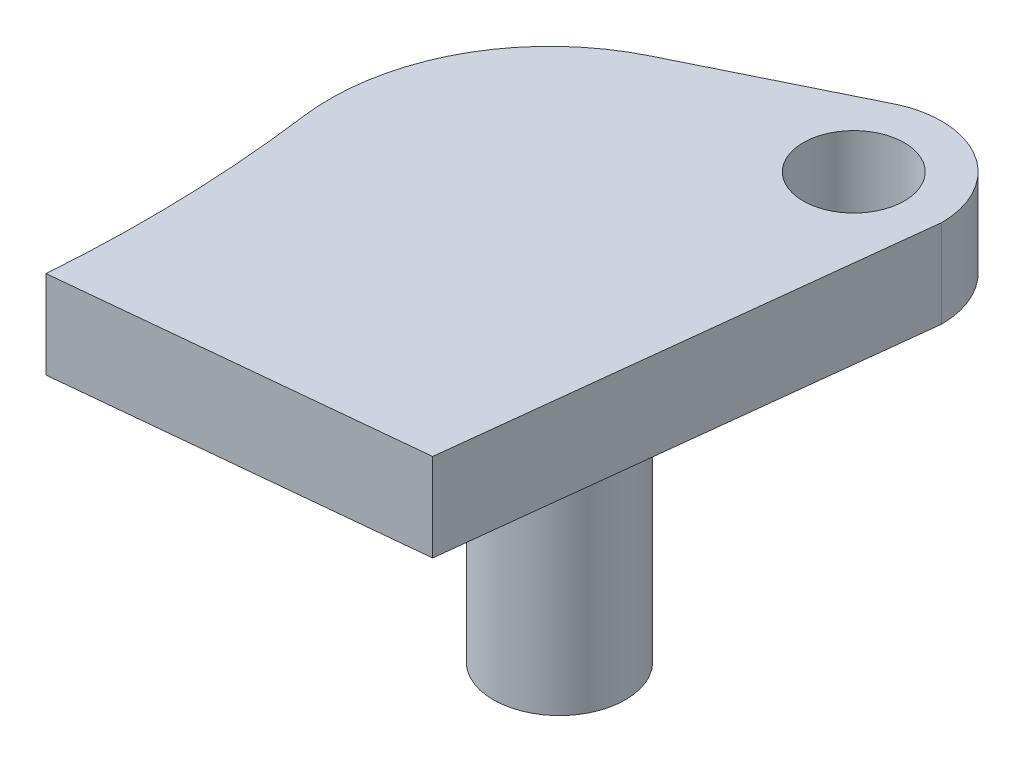
ISO-10303-21;
HEADER;
FILE_DESCRIPTION(('STEP AP214'),'2;1');
FILE_NAME('part.step','',(''),(''),'','','');
FILE_SCHEMA(('AUTOMOTIVE_DESIGN { 1 0 10303 214 1 1 1 1 }'));
ENDSEC;
DATA;
#1=APPLICATION_CONTEXT('core data for automotive mechanical design processes');
#2=APPLICATION_PROTOCOL_DEFINITION('international standard','automotive_design',2000,#1);
#3=PRODUCT_CONTEXT('',#1,'mechanical');
#4=PRODUCT('Part','Part','',(#3));
#5=PRODUCT_RELATED_PRODUCT_CATEGORY('part','',(#4));
#6=PRODUCT_DEFINITION_FORMATION('','',#4);
#7=PRODUCT_DEFINITION_CONTEXT('part definition',#1,'design');
#8=PRODUCT_DEFINITION('design','',#6,#7);
#9=PRODUCT_DEFINITION_SHAPE('','',#8);
#10=(LENGTH_UNIT() NAMED_UNIT(*) SI_UNIT(.MILLI.,.METRE.));
#11=(NAMED_UNIT(*) PLANE_ANGLE_UNIT() SI_UNIT($,.RADIAN.));
#12=(NAMED_UNIT(*) SI_UNIT($,.STERADIAN.) SOLID_ANGLE_UNIT());
#13=UNCERTAINTY_MEASURE_WITH_UNIT(LENGTH_MEASURE(1.E-05),#10,'distance_accuracy_value','');
#14=(GEOMETRIC_REPRESENTATION_CONTEXT(3) GLOBAL_UNCERTAINTY_ASSIGNED_CONTEXT((#13)) GLOBAL_UNIT_ASSIGNED_CONTEXT((#10,
#11,#12)) REPRESENTATION_CONTEXT('',''));
#15=CARTESIAN_POINT('',(0.,0.,0.));
#16=DIRECTION('',(0.,0.,1.));
#17=DIRECTION('',(1.,0.,0.));
#18=AXIS2_PLACEMENT_3D('',#15,#16,#17);
#19=CARTESIAN_POINT('',(-24.9156346445117,2.,-6.86758122529594));
#20=DIRECTION('',(0.,-1.,0.));
#21=DIRECTION('',(0.,0.,-1.));
#22=AXIS2_PLACEMENT_3D('',#19,#20,#21);
#23=CYLINDRICAL_SURFACE('',#22,28.9991720423323);
#24=CARTESIAN_POINT('',(-24.9156346445117,2.,-6.86758122529594));
#25=DIRECTION('',(0.,1.,0.));
#26=DIRECTION('',(0.,0.,1.));
#27=AXIS2_PLACEMENT_3D('',#24,#25,#26);
#28=CIRCLE('',#27,28.9991720423323);
#29=CARTESIAN_POINT('',(4.00038120431635,2.,-4.67304105224966));
#30=VERTEX_POINT('',#29);
#31=CARTESIAN_POINT('',(3.83101762059327,2.,-10.6862148408611));
#32=VERTEX_POINT('',#31);
#33=EDGE_CURVE('E98',#30,#32,#28,.T.);
#34=ORIENTED_EDGE('',*,*,#33,.T.);
#35=DIRECTION('',(0.,-1.,0.));
#36=VECTOR('',#35,1.);
#37=CARTESIAN_POINT('',(3.83101762059327,2.,-10.6862148408611));
#38=LINE('',#37,#36);
#39=CARTESIAN_POINT('',(3.83101762059327,0.,-10.6862148408611));
#40=VERTEX_POINT('',#39);
#41=EDGE_CURVE('E106',#32,#40,#38,.T.);
#42=ORIENTED_EDGE('',*,*,#41,.T.);
#43=CARTESIAN_POINT('',(-24.9156346445117,0.,-6.86758122529594));
#44=DIRECTION('',(0.,1.,0.));
#45=DIRECTION('',(0.,0.,1.));
#46=AXIS2_PLACEMENT_3D('',#43,#44,#45);
#47=CIRCLE('',#46,28.9991720423323);
#48=CARTESIAN_POINT('',(4.00038120431635,0.,-4.67304105224966));
#49=VERTEX_POINT('',#48);
#50=EDGE_CURVE('E100',#49,#40,#47,.T.);
#51=ORIENTED_EDGE('',*,*,#50,.F.);
#52=DIRECTION('',(0.,-1.,0.));
#53=VECTOR('',#52,1.);
#54=CARTESIAN_POINT('',(4.00038120431635,2.,-4.67304105224966));
#55=LINE('',#54,#53);
#56=EDGE_CURVE('E95',#30,#49,#55,.T.);
#57=ORIENTED_EDGE('',*,*,#56,.F.);
#58=EDGE_LOOP('',(#34,#42,#51,#57));
#59=FACE_BOUND('',#58,.T.);
#60=ADVANCED_FACE('F41',(#59),#23,.F.);
#61=CARTESIAN_POINT('',(-0.420916720163327,2.,-4.23344697376737));
#62=DIRECTION('',(0.0989386449958702,0.,0.995093535566572));
#63=DIRECTION('',(0.995093535566572,0.,-0.0989386449958702));
#64=AXIS2_PLACEMENT_3D('',#61,#62,#63);
#65=PLANE('',#64);
#66=DIRECTION('',(-0.995093535566572,0.,0.0989386449958702));
#67=VECTOR('',#66,1.);
#68=CARTESIAN_POINT('',(-0.420916720163327,0.,-4.23344697376737));
#69=LINE('',#68,#67);
#70=CARTESIAN_POINT('',(12.0003812043163,0.,-5.46845287202025));
#71=VERTEX_POINT('',#70);
#72=EDGE_CURVE('E140',#71,#49,#69,.T.);
#73=ORIENTED_EDGE('',*,*,#72,.F.);
#74=DIRECTION('',(0.,-1.,0.));
#75=VECTOR('',#74,1.);
#76=CARTESIAN_POINT('',(12.0003812043163,2.,-5.46845287202025));
#77=LINE('',#76,#75);
#78=CARTESIAN_POINT('',(12.0003812043163,2.,-5.46845287202025));
#79=VERTEX_POINT('',#78);
#80=EDGE_CURVE('E107',#79,#71,#77,.T.);
#81=ORIENTED_EDGE('',*,*,#80,.F.);
#82=DIRECTION('',(-0.995093535566572,0.,0.0989386449958702));
#83=VECTOR('',#82,1.);
#84=CARTESIAN_POINT('',(-0.420916720163327,2.,-4.23344697376737));
#85=LINE('',#84,#83);
#86=EDGE_CURVE('E113',#79,#30,#85,.T.);
#87=ORIENTED_EDGE('',*,*,#86,.T.);
#88=ORIENTED_EDGE('',*,*,#56,.T.);
#89=EDGE_LOOP('',(#73,#81,#87,#88));
#90=FACE_BOUND('',#89,.T.);
#91=ADVANCED_FACE('F118',(#90),#65,.T.);
#92=CARTESIAN_POINT('',(11.2330122571857,2.,1.27773804442567));
#93=DIRECTION('',(-0.993592751476446,0.,-0.113019662950595));
#94=DIRECTION('',(-0.113019662950595,0.,0.993592751476446));
#95=AXIS2_PLACEMENT_3D('',#92,#93,#94);
#96=PLANE('',#95);
#97=DIRECTION('',(0.113019662950595,0.,-0.993592751476446));
#98=VECTOR('',#97,1.);
#99=CARTESIAN_POINT('',(11.2330122571857,0.,1.27773804442567));
#100=LINE('',#99,#98);
#101=CARTESIAN_POINT('',(13.1829386551336,0.,-15.864701459756));
#102=VERTEX_POINT('',#101);
#103=EDGE_CURVE('E144',#71,#102,#100,.T.);
#104=ORIENTED_EDGE('',*,*,#103,.T.);
#105=DIRECTION('',(0.,-1.,0.));
#106=VECTOR('',#105,1.);
#107=CARTESIAN_POINT('',(13.1829386551336,2.,-15.864701459756));
#108=LINE('',#107,#106);
#109=CARTESIAN_POINT('',(13.1829386551336,2.,-15.864701459756));
#110=VERTEX_POINT('',#109);
#111=EDGE_CURVE('E159',#110,#102,#108,.T.);
#112=ORIENTED_EDGE('',*,*,#111,.F.);
#113=DIRECTION('',(0.113019662950595,0.,-0.993592751476446));
#114=VECTOR('',#113,1.);
#115=CARTESIAN_POINT('',(11.2330122571857,2.,1.27773804442567));
#116=LINE('',#115,#114);
#117=EDGE_CURVE('E121',#79,#110,#116,.T.);
#118=ORIENTED_EDGE('',*,*,#117,.F.);
#119=ORIENTED_EDGE('',*,*,#80,.T.);
#120=EDGE_LOOP('',(#104,#112,#118,#119));
#121=FACE_BOUND('',#120,.T.);
#122=ADVANCED_FACE('F176',(#121),#96,.F.);
#123=CARTESIAN_POINT('',(11.1829386551336,2.,-15.864701459756));
#124=DIRECTION('',(0.,-1.,0.));
#125=DIRECTION('',(0.,0.,-1.));
#126=AXIS2_PLACEMENT_3D('',#123,#124,#125);
#127=CYLINDRICAL_SURFACE('',#126,2.);
#128=CARTESIAN_POINT('',(11.1829386551336,0.,-15.864701459756));
#129=DIRECTION('',(0.,1.,0.));
#130=DIRECTION('',(0.,0.,1.));
#131=AXIS2_PLACEMENT_3D('',#128,#129,#130);
#132=CIRCLE('',#131,2.);
#133=CARTESIAN_POINT('',(10.3348110714598,0.,-17.6759661013288));
#134=VERTEX_POINT('',#133);
#135=EDGE_CURVE('E147',#102,#134,#132,.T.);
#136=ORIENTED_EDGE('',*,*,#135,.T.);
#137=DIRECTION('',(0.,-1.,0.));
#138=VECTOR('',#137,1.);
#139=CARTESIAN_POINT('',(10.3348110714598,2.,-17.6759661013288));
#140=LINE('',#139,#138);
#141=CARTESIAN_POINT('',(10.3348110714598,2.,-17.6759661013288));
#142=VERTEX_POINT('',#141);
#143=EDGE_CURVE('E137',#142,#134,#140,.T.);
#144=ORIENTED_EDGE('',*,*,#143,.F.);
#145=CARTESIAN_POINT('',(11.1829386551336,2.,-15.864701459756));
#146=DIRECTION('',(0.,1.,0.));
#147=DIRECTION('',(0.,0.,1.));
#148=AXIS2_PLACEMENT_3D('',#145,#146,#147);
#149=CIRCLE('',#148,2.);
#150=EDGE_CURVE('E124',#110,#142,#149,.T.);
#151=ORIENTED_EDGE('',*,*,#150,.F.);
#152=ORIENTED_EDGE('',*,*,#111,.T.);
#153=EDGE_LOOP('',(#136,#144,#151,#152));
#154=FACE_BOUND('',#153,.T.);
#155=ADVANCED_FACE('F179',(#154),#127,.T.);
#156=CARTESIAN_POINT('',(-4.98626897478635,2.,-10.1475319459011));
#157=DIRECTION('',(0.441011925605157,0.,0.897501243160159));
#158=DIRECTION('',(0.897501243160159,0.,-0.441011925605157));
#159=AXIS2_PLACEMENT_3D('',#156,#157,#158);
#160=PLANE('',#159);
#161=DIRECTION('',(-0.897501243160159,0.,0.441011925605157));
#162=VECTOR('',#161,1.);
#163=CARTESIAN_POINT('',(-4.98626897478635,0.,-10.1475319459011));
#164=LINE('',#163,#162);
#165=CARTESIAN_POINT('',(6.58241885688824,0.,-15.8321249603993));
#166=VERTEX_POINT('',#165);
#167=EDGE_CURVE('E150',#134,#166,#164,.T.);
#168=ORIENTED_EDGE('',*,*,#167,.T.);
#169=DIRECTION('',(0.,1.,0.));
#170=VECTOR('',#169,1.);
#171=CARTESIAN_POINT('',(6.58241885688824,2.,-15.8321249603993));
#172=LINE('',#171,#170);
#173=CARTESIAN_POINT('',(6.58241885688824,2.,-15.8321249603993));
#174=VERTEX_POINT('',#173);
#175=EDGE_CURVE('E50',#166,#174,#172,.T.);
#176=ORIENTED_EDGE('',*,*,#175,.T.);
#177=DIRECTION('',(-0.897501243160159,0.,0.441011925605157));
#178=VECTOR('',#177,1.);
#179=CARTESIAN_POINT('',(-4.98626897478635,2.,-10.1475319459011));
#180=LINE('',#179,#178);
#181=EDGE_CURVE('E130',#142,#174,#180,.T.);
#182=ORIENTED_EDGE('',*,*,#181,.F.);
#183=ORIENTED_EDGE('',*,*,#143,.T.);
#184=EDGE_LOOP('',(#168,#176,#182,#183));
#185=FACE_BOUND('',#184,.T.);
#186=ADVANCED_FACE('F199',(#185),#160,.F.);
#187=CARTESIAN_POINT('',(11.1829386551336,2.,-15.864701459756));
#188=DIRECTION('',(0.,-1.,0.));
#189=DIRECTION('',(0.,0.,-1.));
#190=AXIS2_PLACEMENT_3D('',#187,#188,#189);
#191=CYLINDRICAL_SURFACE('',#190,1.15);
#192=CARTESIAN_POINT('',(11.1829386551336,2.,-15.864701459756));
#193=DIRECTION('',(0.,1.,0.));
#194=DIRECTION('',(0.,0.,1.));
#195=AXIS2_PLACEMENT_3D('',#192,#193,#194);
#196=CIRCLE('',#195,1.15);
#197=CARTESIAN_POINT('',(11.1829386551336,2.,-14.714701459756));
#198=VERTEX_POINT('',#197);
#199=EDGE_CURVE('E133',#198,#198,#196,.T.);
#200=ORIENTED_EDGE('',*,*,#199,.T.);
#201=EDGE_LOOP('',(#200));
#202=FACE_BOUND('',#201,.T.);
#203=CARTESIAN_POINT('',(11.1829386551336,0.,-15.864701459756));
#204=DIRECTION('',(0.,1.,0.));
#205=DIRECTION('',(0.,0.,1.));
#206=AXIS2_PLACEMENT_3D('',#203,#204,#205);
#207=CIRCLE('',#206,1.15);
#208=CARTESIAN_POINT('',(11.1829386551336,0.,-14.714701459756));
#209=VERTEX_POINT('',#208);
#210=EDGE_CURVE('E116',#209,#209,#207,.T.);
#211=ORIENTED_EDGE('',*,*,#210,.F.);
#212=EDGE_LOOP('',(#211));
#213=FACE_BOUND('',#212,.T.);
#214=ADVANCED_FACE('F202',(#202,#213),#191,.F.);
#215=CARTESIAN_POINT('',(0.,2.,0.));
#216=DIRECTION('',(0.,1.,0.));
#217=DIRECTION('',(0.,0.,1.));
#218=AXIS2_PLACEMENT_3D('',#215,#216,#217);
#219=PLANE('',#218);
#220=ORIENTED_EDGE('',*,*,#181,.T.);
#221=CARTESIAN_POINT('',(8.78747848491403,2.,-11.3446187445985));
#222=DIRECTION('',(0.,1.,0.));
#223=DIRECTION('',(0.,0.,1.));
#224=AXIS2_PLACEMENT_3D('',#221,#222,#223);
#225=CIRCLE('',#224,5.);
#226=EDGE_CURVE('E11',#174,#32,#225,.T.);
#227=ORIENTED_EDGE('',*,*,#226,.T.);
#228=ORIENTED_EDGE('',*,*,#33,.F.);
#229=ORIENTED_EDGE('',*,*,#86,.F.);
#230=ORIENTED_EDGE('',*,*,#117,.T.);
#231=ORIENTED_EDGE('',*,*,#150,.T.);
#232=EDGE_LOOP('',(#220,#227,#228,#229,#230,#231));
#233=FACE_BOUND('',#232,.T.);
#234=ORIENTED_EDGE('',*,*,#199,.F.);
#235=EDGE_LOOP('',(#234));
#236=FACE_BOUND('',#235,.T.);
#237=ADVANCED_FACE('F111',(#233,#236),#219,.T.);
#238=CARTESIAN_POINT('',(0.,0.,0.));
#239=DIRECTION('',(0.,1.,0.));
#240=DIRECTION('',(0.,0.,1.));
#241=AXIS2_PLACEMENT_3D('',#238,#239,#240);
#242=PLANE('',#241);
#243=CARTESIAN_POINT('',(10.4875506566564,0.,-9.86470145975602));
#244=DIRECTION('',(0.,1.,0.));
#245=DIRECTION('',(0.,0.,1.));
#246=AXIS2_PLACEMENT_3D('',#243,#244,#245);
#247=CIRCLE('',#246,1.5);
#248=CARTESIAN_POINT('',(10.4875506566564,0.,-8.36470145975602));
#249=VERTEX_POINT('',#248);
#250=EDGE_CURVE('E220',#249,#249,#247,.T.);
#251=ORIENTED_EDGE('',*,*,#250,.T.);
#252=EDGE_LOOP('',(#251));
#253=FACE_BOUND('',#252,.T.);
#254=ORIENTED_EDGE('',*,*,#50,.T.);
#255=CARTESIAN_POINT('',(8.78747848491403,0.,-11.3446187445985));
#256=DIRECTION('',(0.,1.,0.));
#257=DIRECTION('',(0.,0.,1.));
#258=AXIS2_PLACEMENT_3D('',#255,#256,#257);
#259=CIRCLE('',#258,5.);
#260=EDGE_CURVE('E64',#40,#166,#259,.F.);
#261=ORIENTED_EDGE('',*,*,#260,.T.);
#262=ORIENTED_EDGE('',*,*,#167,.F.);
#263=ORIENTED_EDGE('',*,*,#135,.F.);
#264=ORIENTED_EDGE('',*,*,#103,.F.);
#265=ORIENTED_EDGE('',*,*,#72,.T.);
#266=EDGE_LOOP('',(#254,#261,#262,#263,#264,#265));
#267=FACE_BOUND('',#266,.T.);
#268=ORIENTED_EDGE('',*,*,#210,.T.);
#269=EDGE_LOOP('',(#268));
#270=FACE_BOUND('',#269,.T.);
#271=ADVANCED_FACE('F170',(#253,#267,#270),#242,.F.);
#272=CARTESIAN_POINT('',(10.4875506566564,-5.,-9.86470145975602));
#273=DIRECTION('',(0.,1.,0.));
#274=DIRECTION('',(0.,0.,1.));
#275=AXIS2_PLACEMENT_3D('',#272,#273,#274);
#276=CYLINDRICAL_SURFACE('',#275,1.5);
#277=CARTESIAN_POINT('',(10.4875506566564,-5.,-9.86470145975602));
#278=DIRECTION('',(0.,1.,0.));
#279=DIRECTION('',(0.,0.,1.));
#280=AXIS2_PLACEMENT_3D('',#277,#278,#279);
#281=CIRCLE('',#280,1.5);
#282=CARTESIAN_POINT('',(10.4875506566564,-5.,-8.36470145975602));
#283=VERTEX_POINT('',#282);
#284=EDGE_CURVE('E141',#283,#283,#281,.T.);
#285=ORIENTED_EDGE('',*,*,#284,.T.);
#286=EDGE_LOOP('',(#285));
#287=FACE_BOUND('',#286,.T.);
#288=ORIENTED_EDGE('',*,*,#250,.F.);
#289=EDGE_LOOP('',(#288));
#290=FACE_BOUND('',#289,.T.);
#291=ADVANCED_FACE('F186',(#287,#290),#276,.T.);
#292=CARTESIAN_POINT('',(10.4875506566564,-5.,-9.86470145975602));
#293=DIRECTION('',(0.,1.,0.));
#294=DIRECTION('',(0.,0.,1.));
#295=AXIS2_PLACEMENT_3D('',#292,#293,#294);
#296=PLANE('',#295);
#297=ORIENTED_EDGE('',*,*,#284,.F.);
#298=EDGE_LOOP('',(#297));
#299=FACE_BOUND('',#298,.T.);
#300=ADVANCED_FACE('F182',(#299),#296,.F.);
#301=CARTESIAN_POINT('',(8.78747848491403,2.,-11.3446187445985));
#302=DIRECTION('',(0.,-1.,0.));
#303=DIRECTION('',(0.,0.,-1.));
#304=AXIS2_PLACEMENT_3D('',#301,#302,#303);
#305=CYLINDRICAL_SURFACE('',#304,5.);
#306=ORIENTED_EDGE('',*,*,#226,.F.);
#307=ORIENTED_EDGE('',*,*,#175,.F.);
#308=ORIENTED_EDGE('',*,*,#260,.F.);
#309=ORIENTED_EDGE('',*,*,#41,.F.);
#310=EDGE_LOOP('',(#306,#307,#308,#309));
#311=FACE_BOUND('',#310,.T.);
#312=ADVANCED_FACE('F43',(#311),#305,.T.);
#313=CLOSED_SHELL('',(#60,#91,#122,#155,#186,#214,#237,#271,#291,#300,#312));
#314=MANIFOLD_SOLID_BREP('B2',#313);
#315=ADVANCED_BREP_SHAPE_REPRESENTATION('',(#18,#314),#14);
#316=SHAPE_DEFINITION_REPRESENTATION(#9,#315);
ENDSEC;
END-ISO-10303-21;
